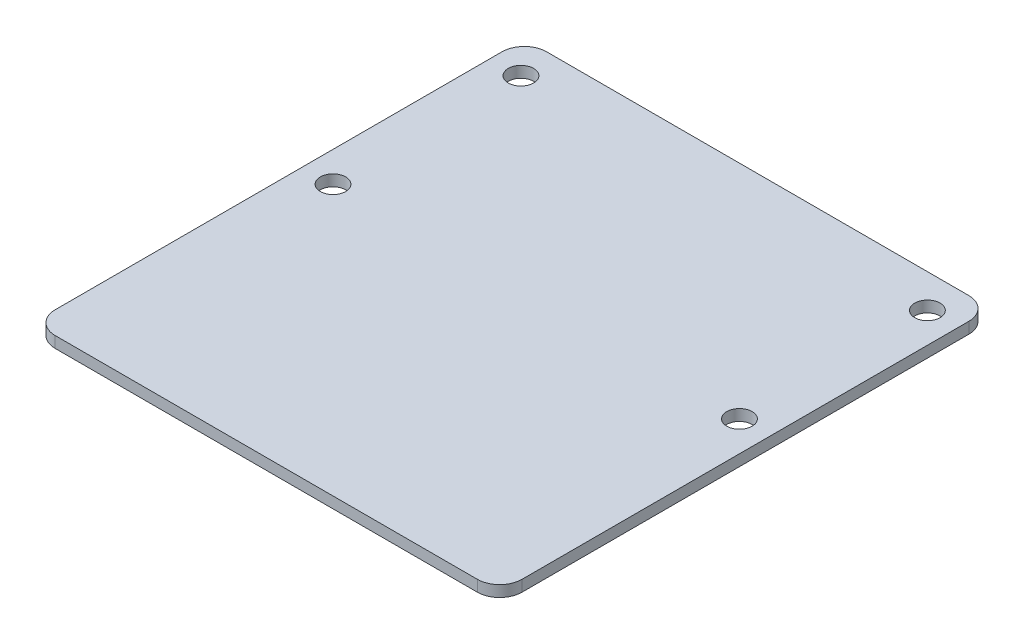
ISO-10303-21;
HEADER;
FILE_DESCRIPTION(('STEP AP214'),'2;1');
FILE_NAME('part.step','',(''),(''),'','','');
FILE_SCHEMA(('AUTOMOTIVE_DESIGN { 1 0 10303 214 1 1 1 1 }'));
ENDSEC;
DATA;
#1=APPLICATION_CONTEXT('core data for automotive mechanical design processes');
#2=APPLICATION_PROTOCOL_DEFINITION('international standard','automotive_design',2000,#1);
#3=PRODUCT_CONTEXT('',#1,'mechanical');
#4=PRODUCT('Part','Part','',(#3));
#5=PRODUCT_RELATED_PRODUCT_CATEGORY('part','',(#4));
#6=PRODUCT_DEFINITION_FORMATION('','',#4);
#7=PRODUCT_DEFINITION_CONTEXT('part definition',#1,'design');
#8=PRODUCT_DEFINITION('design','',#6,#7);
#9=PRODUCT_DEFINITION_SHAPE('','',#8);
#10=(LENGTH_UNIT() NAMED_UNIT(*) SI_UNIT(.MILLI.,.METRE.));
#11=(NAMED_UNIT(*) PLANE_ANGLE_UNIT() SI_UNIT($,.RADIAN.));
#12=(NAMED_UNIT(*) SI_UNIT($,.STERADIAN.) SOLID_ANGLE_UNIT());
#13=UNCERTAINTY_MEASURE_WITH_UNIT(LENGTH_MEASURE(1.E-05),#10,'distance_accuracy_value','');
#14=(GEOMETRIC_REPRESENTATION_CONTEXT(3) GLOBAL_UNCERTAINTY_ASSIGNED_CONTEXT((#13)) GLOBAL_UNIT_ASSIGNED_CONTEXT((#10,
#11,#12)) REPRESENTATION_CONTEXT('',''));
#15=CARTESIAN_POINT('',(0.,0.,0.));
#16=DIRECTION('',(0.,0.,1.));
#17=DIRECTION('',(1.,0.,0.));
#18=AXIS2_PLACEMENT_3D('',#15,#16,#17);
#19=CARTESIAN_POINT('',(31.3,1.5,-32.95));
#20=DIRECTION('',(-1.,0.,0.));
#21=DIRECTION('',(0.,0.,1.));
#22=AXIS2_PLACEMENT_3D('',#19,#20,#21);
#23=PLANE('',#22);
#24=DIRECTION('',(0.,0.,-1.));
#25=VECTOR('',#24,1.);
#26=CARTESIAN_POINT('',(31.3,1.5,-32.95));
#27=LINE('',#26,#25);
#28=CARTESIAN_POINT('',(31.3,1.5,29.95));
#29=VERTEX_POINT('',#28);
#30=CARTESIAN_POINT('',(31.3,1.5,-29.95));
#31=VERTEX_POINT('',#30);
#32=EDGE_CURVE('E123',#29,#31,#27,.T.);
#33=ORIENTED_EDGE('',*,*,#32,.F.);
#34=DIRECTION('',(0.,-1.,0.));
#35=VECTOR('',#34,1.);
#36=CARTESIAN_POINT('',(31.3,1.5,29.95));
#37=LINE('',#36,#35);
#38=CARTESIAN_POINT('',(31.3,0.,29.95));
#39=VERTEX_POINT('',#38);
#40=EDGE_CURVE('E108',#29,#39,#37,.T.);
#41=ORIENTED_EDGE('',*,*,#40,.T.);
#42=DIRECTION('',(0.,0.,-1.));
#43=VECTOR('',#42,1.);
#44=CARTESIAN_POINT('',(31.3,0.,-32.95));
#45=LINE('',#44,#43);
#46=CARTESIAN_POINT('',(31.3,0.,-29.95));
#47=VERTEX_POINT('',#46);
#48=EDGE_CURVE('E120',#39,#47,#45,.T.);
#49=ORIENTED_EDGE('',*,*,#48,.T.);
#50=DIRECTION('',(0.,-1.,0.));
#51=VECTOR('',#50,1.);
#52=CARTESIAN_POINT('',(31.3,1.5,-29.95));
#53=LINE('',#52,#51);
#54=EDGE_CURVE('E125',#47,#31,#53,.F.);
#55=ORIENTED_EDGE('',*,*,#54,.T.);
#56=EDGE_LOOP('',(#33,#41,#49,#55));
#57=FACE_BOUND('',#56,.T.);
#58=ADVANCED_FACE('F38',(#57),#23,.F.);
#59=CARTESIAN_POINT('',(-31.3,1.5,-32.95));
#60=DIRECTION('',(0.,0.,1.));
#61=DIRECTION('',(1.,0.,0.));
#62=AXIS2_PLACEMENT_3D('',#59,#60,#61);
#63=PLANE('',#62);
#64=DIRECTION('',(-1.,0.,0.));
#65=VECTOR('',#64,1.);
#66=CARTESIAN_POINT('',(-31.3,1.5,-32.95));
#67=LINE('',#66,#65);
#68=CARTESIAN_POINT('',(28.3,1.5,-32.95));
#69=VERTEX_POINT('',#68);
#70=CARTESIAN_POINT('',(-28.3,1.5,-32.95));
#71=VERTEX_POINT('',#70);
#72=EDGE_CURVE('E169',#69,#71,#67,.T.);
#73=ORIENTED_EDGE('',*,*,#72,.F.);
#74=DIRECTION('',(0.,-1.,0.));
#75=VECTOR('',#74,1.);
#76=CARTESIAN_POINT('',(28.3,1.5,-32.95));
#77=LINE('',#76,#75);
#78=CARTESIAN_POINT('',(28.3,0.,-32.95));
#79=VERTEX_POINT('',#78);
#80=EDGE_CURVE('E162',#69,#79,#77,.T.);
#81=ORIENTED_EDGE('',*,*,#80,.T.);
#82=DIRECTION('',(-1.,0.,0.));
#83=VECTOR('',#82,1.);
#84=CARTESIAN_POINT('',(-31.3,0.,-32.95));
#85=LINE('',#84,#83);
#86=CARTESIAN_POINT('',(-28.3,0.,-32.95));
#87=VERTEX_POINT('',#86);
#88=EDGE_CURVE('E129',#79,#87,#85,.T.);
#89=ORIENTED_EDGE('',*,*,#88,.T.);
#90=DIRECTION('',(0.,-1.,0.));
#91=VECTOR('',#90,1.);
#92=CARTESIAN_POINT('',(-28.3,1.5,-32.95));
#93=LINE('',#92,#91);
#94=EDGE_CURVE('E160',#87,#71,#93,.F.);
#95=ORIENTED_EDGE('',*,*,#94,.T.);
#96=EDGE_LOOP('',(#73,#81,#89,#95));
#97=FACE_BOUND('',#96,.T.);
#98=ADVANCED_FACE('F167',(#97),#63,.F.);
#99=CARTESIAN_POINT('',(-31.3,1.5,-32.95));
#100=DIRECTION('',(1.,0.,0.));
#101=DIRECTION('',(0.,0.,-1.));
#102=AXIS2_PLACEMENT_3D('',#99,#100,#101);
#103=PLANE('',#102);
#104=DIRECTION('',(0.,0.,1.));
#105=VECTOR('',#104,1.);
#106=CARTESIAN_POINT('',(-31.3,1.5,-32.95));
#107=LINE('',#106,#105);
#108=CARTESIAN_POINT('',(-31.3,1.5,-29.95));
#109=VERTEX_POINT('',#108);
#110=CARTESIAN_POINT('',(-31.3,1.5,29.95));
#111=VERTEX_POINT('',#110);
#112=EDGE_CURVE('E177',#109,#111,#107,.T.);
#113=ORIENTED_EDGE('',*,*,#112,.F.);
#114=DIRECTION('',(0.,-1.,0.));
#115=VECTOR('',#114,1.);
#116=CARTESIAN_POINT('',(-31.3,1.5,-29.95));
#117=LINE('',#116,#115);
#118=CARTESIAN_POINT('',(-31.3,0.,-29.95));
#119=VERTEX_POINT('',#118);
#120=EDGE_CURVE('E11',#109,#119,#117,.T.);
#121=ORIENTED_EDGE('',*,*,#120,.T.);
#122=DIRECTION('',(0.,0.,1.));
#123=VECTOR('',#122,1.);
#124=CARTESIAN_POINT('',(-31.3,0.,-32.95));
#125=LINE('',#124,#123);
#126=CARTESIAN_POINT('',(-31.3,0.,29.95));
#127=VERTEX_POINT('',#126);
#128=EDGE_CURVE('E133',#119,#127,#125,.T.);
#129=ORIENTED_EDGE('',*,*,#128,.T.);
#130=DIRECTION('',(0.,-1.,0.));
#131=VECTOR('',#130,1.);
#132=CARTESIAN_POINT('',(-31.3,1.5,29.95));
#133=LINE('',#132,#131);
#134=EDGE_CURVE('E46',#127,#111,#133,.F.);
#135=ORIENTED_EDGE('',*,*,#134,.T.);
#136=EDGE_LOOP('',(#113,#121,#129,#135));
#137=FACE_BOUND('',#136,.T.);
#138=ADVANCED_FACE('F176',(#137),#103,.F.);
#139=CARTESIAN_POINT('',(-31.3,1.5,32.95));
#140=DIRECTION('',(0.,0.,-1.));
#141=DIRECTION('',(-1.,0.,0.));
#142=AXIS2_PLACEMENT_3D('',#139,#140,#141);
#143=PLANE('',#142);
#144=DIRECTION('',(1.,0.,0.));
#145=VECTOR('',#144,1.);
#146=CARTESIAN_POINT('',(-31.3,0.,32.95));
#147=LINE('',#146,#145);
#148=CARTESIAN_POINT('',(-28.3,0.,32.95));
#149=VERTEX_POINT('',#148);
#150=CARTESIAN_POINT('',(28.3,0.,32.95));
#151=VERTEX_POINT('',#150);
#152=EDGE_CURVE('E143',#149,#151,#147,.T.);
#153=ORIENTED_EDGE('',*,*,#152,.T.);
#154=DIRECTION('',(0.,-1.,0.));
#155=VECTOR('',#154,1.);
#156=CARTESIAN_POINT('',(28.3,1.5,32.95));
#157=LINE('',#156,#155);
#158=CARTESIAN_POINT('',(28.3,1.5,32.95));
#159=VERTEX_POINT('',#158);
#160=EDGE_CURVE('E109',#151,#159,#157,.F.);
#161=ORIENTED_EDGE('',*,*,#160,.T.);
#162=DIRECTION('',(1.,0.,0.));
#163=VECTOR('',#162,1.);
#164=CARTESIAN_POINT('',(-31.3,1.5,32.95));
#165=LINE('',#164,#163);
#166=CARTESIAN_POINT('',(-28.3,1.5,32.95));
#167=VERTEX_POINT('',#166);
#168=EDGE_CURVE('E139',#167,#159,#165,.T.);
#169=ORIENTED_EDGE('',*,*,#168,.F.);
#170=DIRECTION('',(0.,-1.,0.));
#171=VECTOR('',#170,1.);
#172=CARTESIAN_POINT('',(-28.3,1.5,32.95));
#173=LINE('',#172,#171);
#174=EDGE_CURVE('E114',#167,#149,#173,.T.);
#175=ORIENTED_EDGE('',*,*,#174,.T.);
#176=EDGE_LOOP('',(#153,#161,#169,#175));
#177=FACE_BOUND('',#176,.T.);
#178=ADVANCED_FACE('F217',(#177),#143,.F.);
#179=CARTESIAN_POINT('',(0.,1.5,0.));
#180=DIRECTION('',(0.,1.,0.));
#181=DIRECTION('',(0.,0.,1.));
#182=AXIS2_PLACEMENT_3D('',#179,#180,#181);
#183=PLANE('',#182);
#184=CARTESIAN_POINT('',(-27.25,1.5,-3.25000000000001));
#185=DIRECTION('',(0.,1.,0.));
#186=DIRECTION('',(0.,0.,1.));
#187=AXIS2_PLACEMENT_3D('',#184,#185,#186);
#188=CIRCLE('',#187,1.7);
#189=CARTESIAN_POINT('',(-27.25,1.5,-1.55000000000001));
#190=VERTEX_POINT('',#189);
#191=EDGE_CURVE('E193',#190,#190,#188,.T.);
#192=ORIENTED_EDGE('',*,*,#191,.F.);
#193=EDGE_LOOP('',(#192));
#194=FACE_BOUND('',#193,.T.);
#195=CARTESIAN_POINT('',(27.25,1.5,-28.45));
#196=DIRECTION('',(0.,1.,0.));
#197=DIRECTION('',(0.,0.,1.));
#198=AXIS2_PLACEMENT_3D('',#195,#196,#197);
#199=CIRCLE('',#198,1.7);
#200=CARTESIAN_POINT('',(27.25,1.5,-26.75));
#201=VERTEX_POINT('',#200);
#202=EDGE_CURVE('E186',#201,#201,#199,.T.);
#203=ORIENTED_EDGE('',*,*,#202,.F.);
#204=EDGE_LOOP('',(#203));
#205=FACE_BOUND('',#204,.T.);
#206=CARTESIAN_POINT('',(27.25,1.5,-3.25000000000001));
#207=DIRECTION('',(0.,1.,0.));
#208=DIRECTION('',(0.,0.,1.));
#209=AXIS2_PLACEMENT_3D('',#206,#207,#208);
#210=CIRCLE('',#209,1.7);
#211=CARTESIAN_POINT('',(27.25,1.5,-1.55000000000001));
#212=VERTEX_POINT('',#211);
#213=EDGE_CURVE('E198',#212,#212,#210,.T.);
#214=ORIENTED_EDGE('',*,*,#213,.F.);
#215=EDGE_LOOP('',(#214));
#216=FACE_BOUND('',#215,.T.);
#217=CARTESIAN_POINT('',(-27.25,1.5,-28.45));
#218=DIRECTION('',(0.,1.,0.));
#219=DIRECTION('',(0.,0.,1.));
#220=AXIS2_PLACEMENT_3D('',#217,#218,#219);
#221=CIRCLE('',#220,1.7);
#222=CARTESIAN_POINT('',(-27.25,1.5,-26.75));
#223=VERTEX_POINT('',#222);
#224=EDGE_CURVE('E136',#223,#223,#221,.T.);
#225=ORIENTED_EDGE('',*,*,#224,.F.);
#226=EDGE_LOOP('',(#225));
#227=FACE_BOUND('',#226,.T.);
#228=ORIENTED_EDGE('',*,*,#168,.T.);
#229=CARTESIAN_POINT('',(28.3,1.5,29.95));
#230=DIRECTION('',(0.,1.,0.));
#231=DIRECTION('',(0.,0.,1.));
#232=AXIS2_PLACEMENT_3D('',#229,#230,#231);
#233=CIRCLE('',#232,3.);
#234=EDGE_CURVE('E158',#159,#29,#233,.T.);
#235=ORIENTED_EDGE('',*,*,#234,.T.);
#236=ORIENTED_EDGE('',*,*,#32,.T.);
#237=CARTESIAN_POINT('',(28.3,1.5,-29.95));
#238=DIRECTION('',(0.,1.,0.));
#239=DIRECTION('',(0.,0.,1.));
#240=AXIS2_PLACEMENT_3D('',#237,#238,#239);
#241=CIRCLE('',#240,3.);
#242=EDGE_CURVE('E156',#31,#69,#241,.T.);
#243=ORIENTED_EDGE('',*,*,#242,.T.);
#244=ORIENTED_EDGE('',*,*,#72,.T.);
#245=CARTESIAN_POINT('',(-28.3,1.5,-29.95));
#246=DIRECTION('',(0.,1.,0.));
#247=DIRECTION('',(0.,0.,1.));
#248=AXIS2_PLACEMENT_3D('',#245,#246,#247);
#249=CIRCLE('',#248,3.);
#250=EDGE_CURVE('E59',#71,#109,#249,.T.);
#251=ORIENTED_EDGE('',*,*,#250,.T.);
#252=ORIENTED_EDGE('',*,*,#112,.T.);
#253=CARTESIAN_POINT('',(-28.3,1.5,29.95));
#254=DIRECTION('',(0.,1.,0.));
#255=DIRECTION('',(0.,0.,1.));
#256=AXIS2_PLACEMENT_3D('',#253,#254,#255);
#257=CIRCLE('',#256,3.);
#258=EDGE_CURVE('E153',#111,#167,#257,.T.);
#259=ORIENTED_EDGE('',*,*,#258,.T.);
#260=EDGE_LOOP('',(#228,#235,#236,#243,#244,#251,#252,#259));
#261=FACE_BOUND('',#260,.T.);
#262=ADVANCED_FACE('F214',(#194,#205,#216,#227,#261),#183,.T.);
#263=CARTESIAN_POINT('',(0.,0.,0.));
#264=DIRECTION('',(0.,1.,0.));
#265=DIRECTION('',(0.,0.,1.));
#266=AXIS2_PLACEMENT_3D('',#263,#264,#265);
#267=PLANE('',#266);
#268=CARTESIAN_POINT('',(-27.25,0.,-3.25000000000001));
#269=DIRECTION('',(0.,1.,0.));
#270=DIRECTION('',(0.,0.,1.));
#271=AXIS2_PLACEMENT_3D('',#268,#269,#270);
#272=CIRCLE('',#271,1.7);
#273=CARTESIAN_POINT('',(-27.25,0.,-1.55000000000001));
#274=VERTEX_POINT('',#273);
#275=EDGE_CURVE('E184',#274,#274,#272,.T.);
#276=ORIENTED_EDGE('',*,*,#275,.T.);
#277=EDGE_LOOP('',(#276));
#278=FACE_BOUND('',#277,.T.);
#279=CARTESIAN_POINT('',(27.25,0.,-28.45));
#280=DIRECTION('',(0.,1.,0.));
#281=DIRECTION('',(0.,0.,1.));
#282=AXIS2_PLACEMENT_3D('',#279,#280,#281);
#283=CIRCLE('',#282,1.7);
#284=CARTESIAN_POINT('',(27.25,0.,-26.75));
#285=VERTEX_POINT('',#284);
#286=EDGE_CURVE('E189',#285,#285,#283,.T.);
#287=ORIENTED_EDGE('',*,*,#286,.T.);
#288=EDGE_LOOP('',(#287));
#289=FACE_BOUND('',#288,.T.);
#290=CARTESIAN_POINT('',(27.25,0.,-3.25000000000001));
#291=DIRECTION('',(0.,1.,0.));
#292=DIRECTION('',(0.,0.,1.));
#293=AXIS2_PLACEMENT_3D('',#290,#291,#292);
#294=CIRCLE('',#293,1.7);
#295=CARTESIAN_POINT('',(27.25,0.,-1.55000000000001));
#296=VERTEX_POINT('',#295);
#297=EDGE_CURVE('E190',#296,#296,#294,.T.);
#298=ORIENTED_EDGE('',*,*,#297,.T.);
#299=EDGE_LOOP('',(#298));
#300=FACE_BOUND('',#299,.T.);
#301=CARTESIAN_POINT('',(-27.25,0.,-28.45));
#302=DIRECTION('',(0.,1.,0.));
#303=DIRECTION('',(0.,0.,1.));
#304=AXIS2_PLACEMENT_3D('',#301,#302,#303);
#305=CIRCLE('',#304,1.7);
#306=CARTESIAN_POINT('',(-27.25,0.,-26.75));
#307=VERTEX_POINT('',#306);
#308=EDGE_CURVE('E130',#307,#307,#305,.T.);
#309=ORIENTED_EDGE('',*,*,#308,.T.);
#310=EDGE_LOOP('',(#309));
#311=FACE_BOUND('',#310,.T.);
#312=ORIENTED_EDGE('',*,*,#48,.F.);
#313=CARTESIAN_POINT('',(28.3,0.,29.95));
#314=DIRECTION('',(0.,1.,0.));
#315=DIRECTION('',(0.,0.,1.));
#316=AXIS2_PLACEMENT_3D('',#313,#314,#315);
#317=CIRCLE('',#316,3.);
#318=EDGE_CURVE('E104',#39,#151,#317,.F.);
#319=ORIENTED_EDGE('',*,*,#318,.T.);
#320=ORIENTED_EDGE('',*,*,#152,.F.);
#321=CARTESIAN_POINT('',(-28.3,0.,29.95));
#322=DIRECTION('',(0.,1.,0.));
#323=DIRECTION('',(0.,0.,1.));
#324=AXIS2_PLACEMENT_3D('',#321,#322,#323);
#325=CIRCLE('',#324,3.);
#326=EDGE_CURVE('E124',#149,#127,#325,.F.);
#327=ORIENTED_EDGE('',*,*,#326,.T.);
#328=ORIENTED_EDGE('',*,*,#128,.F.);
#329=CARTESIAN_POINT('',(-28.3,0.,-29.95));
#330=DIRECTION('',(0.,1.,0.));
#331=DIRECTION('',(0.,0.,1.));
#332=AXIS2_PLACEMENT_3D('',#329,#330,#331);
#333=CIRCLE('',#332,3.);
#334=EDGE_CURVE('E147',#119,#87,#333,.F.);
#335=ORIENTED_EDGE('',*,*,#334,.T.);
#336=ORIENTED_EDGE('',*,*,#88,.F.);
#337=CARTESIAN_POINT('',(28.3,0.,-29.95));
#338=DIRECTION('',(0.,1.,0.));
#339=DIRECTION('',(0.,0.,1.));
#340=AXIS2_PLACEMENT_3D('',#337,#338,#339);
#341=CIRCLE('',#340,3.);
#342=EDGE_CURVE('E115',#79,#47,#341,.F.);
#343=ORIENTED_EDGE('',*,*,#342,.T.);
#344=EDGE_LOOP('',(#312,#319,#320,#327,#328,#335,#336,#343));
#345=FACE_BOUND('',#344,.T.);
#346=ADVANCED_FACE('F127',(#278,#289,#300,#311,#345),#267,.F.);
#347=CARTESIAN_POINT('',(28.3,1.5,29.95));
#348=DIRECTION('',(0.,-1.,0.));
#349=DIRECTION('',(0.,0.,-1.));
#350=AXIS2_PLACEMENT_3D('',#347,#348,#349);
#351=CYLINDRICAL_SURFACE('',#350,3.);
#352=ORIENTED_EDGE('',*,*,#234,.F.);
#353=ORIENTED_EDGE('',*,*,#160,.F.);
#354=ORIENTED_EDGE('',*,*,#318,.F.);
#355=ORIENTED_EDGE('',*,*,#40,.F.);
#356=EDGE_LOOP('',(#352,#353,#354,#355));
#357=FACE_BOUND('',#356,.T.);
#358=ADVANCED_FACE('F107',(#357),#351,.T.);
#359=CARTESIAN_POINT('',(28.3,1.5,-29.95));
#360=DIRECTION('',(0.,-1.,0.));
#361=DIRECTION('',(0.,0.,-1.));
#362=AXIS2_PLACEMENT_3D('',#359,#360,#361);
#363=CYLINDRICAL_SURFACE('',#362,3.);
#364=ORIENTED_EDGE('',*,*,#242,.F.);
#365=ORIENTED_EDGE('',*,*,#54,.F.);
#366=ORIENTED_EDGE('',*,*,#342,.F.);
#367=ORIENTED_EDGE('',*,*,#80,.F.);
#368=EDGE_LOOP('',(#364,#365,#366,#367));
#369=FACE_BOUND('',#368,.T.);
#370=ADVANCED_FACE('F232',(#369),#363,.T.);
#371=CARTESIAN_POINT('',(-28.3,1.5,-29.95));
#372=DIRECTION('',(0.,-1.,0.));
#373=DIRECTION('',(0.,0.,-1.));
#374=AXIS2_PLACEMENT_3D('',#371,#372,#373);
#375=CYLINDRICAL_SURFACE('',#374,3.);
#376=ORIENTED_EDGE('',*,*,#250,.F.);
#377=ORIENTED_EDGE('',*,*,#94,.F.);
#378=ORIENTED_EDGE('',*,*,#334,.F.);
#379=ORIENTED_EDGE('',*,*,#120,.F.);
#380=EDGE_LOOP('',(#376,#377,#378,#379));
#381=FACE_BOUND('',#380,.T.);
#382=ADVANCED_FACE('F175',(#381),#375,.T.);
#383=CARTESIAN_POINT('',(-28.3,1.5,29.95));
#384=DIRECTION('',(0.,-1.,0.));
#385=DIRECTION('',(0.,0.,-1.));
#386=AXIS2_PLACEMENT_3D('',#383,#384,#385);
#387=CYLINDRICAL_SURFACE('',#386,3.);
#388=ORIENTED_EDGE('',*,*,#258,.F.);
#389=ORIENTED_EDGE('',*,*,#134,.F.);
#390=ORIENTED_EDGE('',*,*,#326,.F.);
#391=ORIENTED_EDGE('',*,*,#174,.F.);
#392=EDGE_LOOP('',(#388,#389,#390,#391));
#393=FACE_BOUND('',#392,.T.);
#394=ADVANCED_FACE('F40',(#393),#387,.T.);
#395=CARTESIAN_POINT('',(-27.25,0.,-28.45));
#396=DIRECTION('',(0.,1.,0.));
#397=DIRECTION('',(0.,0.,1.));
#398=AXIS2_PLACEMENT_3D('',#395,#396,#397);
#399=CYLINDRICAL_SURFACE('',#398,1.7);
#400=ORIENTED_EDGE('',*,*,#308,.F.);
#401=EDGE_LOOP('',(#400));
#402=FACE_BOUND('',#401,.T.);
#403=ORIENTED_EDGE('',*,*,#224,.T.);
#404=EDGE_LOOP('',(#403));
#405=FACE_BOUND('',#404,.T.);
#406=ADVANCED_FACE('F210',(#402,#405),#399,.F.);
#407=CARTESIAN_POINT('',(27.25,0.,-3.25000000000001));
#408=DIRECTION('',(0.,1.,0.));
#409=DIRECTION('',(0.,0.,1.));
#410=AXIS2_PLACEMENT_3D('',#407,#408,#409);
#411=CYLINDRICAL_SURFACE('',#410,1.7);
#412=ORIENTED_EDGE('',*,*,#297,.F.);
#413=EDGE_LOOP('',(#412));
#414=FACE_BOUND('',#413,.T.);
#415=ORIENTED_EDGE('',*,*,#213,.T.);
#416=EDGE_LOOP('',(#415));
#417=FACE_BOUND('',#416,.T.);
#418=ADVANCED_FACE('F206',(#414,#417),#411,.F.);
#419=CARTESIAN_POINT('',(27.25,0.,-28.45));
#420=DIRECTION('',(0.,1.,0.));
#421=DIRECTION('',(0.,0.,1.));
#422=AXIS2_PLACEMENT_3D('',#419,#420,#421);
#423=CYLINDRICAL_SURFACE('',#422,1.7);
#424=ORIENTED_EDGE('',*,*,#286,.F.);
#425=EDGE_LOOP('',(#424));
#426=FACE_BOUND('',#425,.T.);
#427=ORIENTED_EDGE('',*,*,#202,.T.);
#428=EDGE_LOOP('',(#427));
#429=FACE_BOUND('',#428,.T.);
#430=ADVANCED_FACE('F209',(#426,#429),#423,.F.);
#431=CARTESIAN_POINT('',(-27.25,0.,-3.25000000000001));
#432=DIRECTION('',(0.,1.,0.));
#433=DIRECTION('',(0.,0.,1.));
#434=AXIS2_PLACEMENT_3D('',#431,#432,#433);
#435=CYLINDRICAL_SURFACE('',#434,1.7);
#436=ORIENTED_EDGE('',*,*,#275,.F.);
#437=EDGE_LOOP('',(#436));
#438=FACE_BOUND('',#437,.T.);
#439=ORIENTED_EDGE('',*,*,#191,.T.);
#440=EDGE_LOOP('',(#439));
#441=FACE_BOUND('',#440,.T.);
#442=ADVANCED_FACE('F298',(#438,#441),#435,.F.);
#443=CLOSED_SHELL('',(#58,#98,#138,#178,#262,#346,#358,#370,#382,#394,#406,#418,#430,#442));
#444=MANIFOLD_SOLID_BREP('B2',#443);
#445=ADVANCED_BREP_SHAPE_REPRESENTATION('',(#18,#444),#14);
#446=SHAPE_DEFINITION_REPRESENTATION(#9,#445);
ENDSEC;
END-ISO-10303-21;
